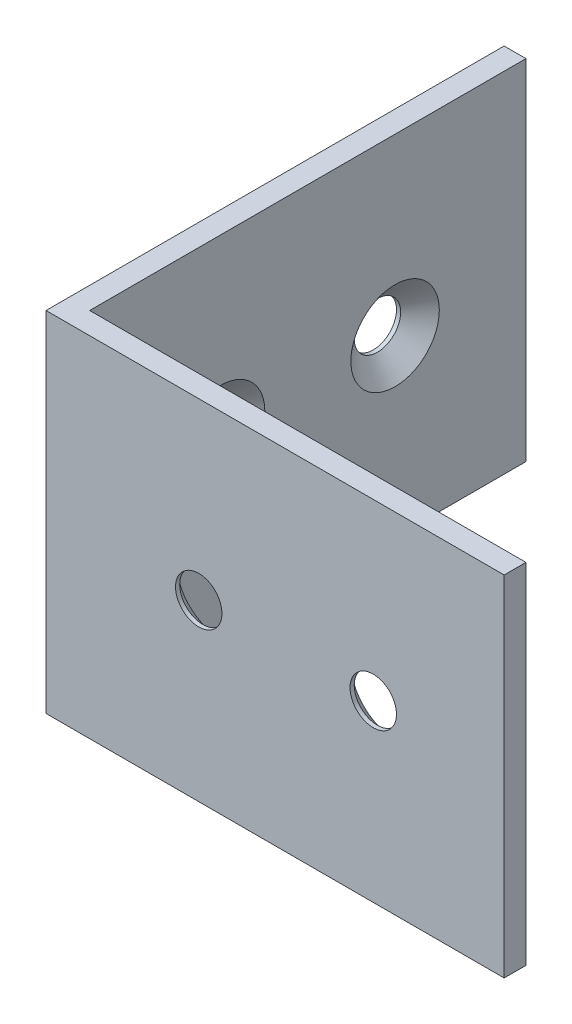
ISO-10303-21;
HEADER;
FILE_DESCRIPTION(('STEP AP214'),'2;1');
FILE_NAME('part.step','',(''),(''),'','','');
FILE_SCHEMA(('AUTOMOTIVE_DESIGN { 1 0 10303 214 1 1 1 1 }'));
ENDSEC;
DATA;
#1=APPLICATION_CONTEXT('core data for automotive mechanical design processes');
#2=APPLICATION_PROTOCOL_DEFINITION('international standard','automotive_design',2000,#1);
#3=PRODUCT_CONTEXT('',#1,'mechanical');
#4=PRODUCT('Part','Part','',(#3));
#5=PRODUCT_RELATED_PRODUCT_CATEGORY('part','',(#4));
#6=PRODUCT_DEFINITION_FORMATION('','',#4);
#7=PRODUCT_DEFINITION_CONTEXT('part definition',#1,'design');
#8=PRODUCT_DEFINITION('design','',#6,#7);
#9=PRODUCT_DEFINITION_SHAPE('','',#8);
#10=(LENGTH_UNIT() NAMED_UNIT(*) SI_UNIT(.MILLI.,.METRE.));
#11=(NAMED_UNIT(*) PLANE_ANGLE_UNIT() SI_UNIT($,.RADIAN.));
#12=(NAMED_UNIT(*) SI_UNIT($,.STERADIAN.) SOLID_ANGLE_UNIT());
#13=UNCERTAINTY_MEASURE_WITH_UNIT(LENGTH_MEASURE(1.E-05),#10,'distance_accuracy_value','');
#14=(GEOMETRIC_REPRESENTATION_CONTEXT(3) GLOBAL_UNCERTAINTY_ASSIGNED_CONTEXT((#13)) GLOBAL_UNIT_ASSIGNED_CONTEXT((#10,
#11,#12)) REPRESENTATION_CONTEXT('',''));
#15=CARTESIAN_POINT('',(0.,0.,0.));
#16=DIRECTION('',(0.,0.,1.));
#17=DIRECTION('',(1.,0.,0.));
#18=AXIS2_PLACEMENT_3D('',#15,#16,#17);
#19=CARTESIAN_POINT('',(66.675,50.8,3.175));
#20=DIRECTION('',(0.,0.,-1.));
#21=DIRECTION('',(-1.,0.,0.));
#22=AXIS2_PLACEMENT_3D('',#19,#20,#21);
#23=PLANE('',#22);
#24=CARTESIAN_POINT('',(47.625,25.4,3.17500000000001));
#25=DIRECTION('',(0.,0.,-1.));
#26=DIRECTION('',(-1.,0.,0.));
#27=AXIS2_PLACEMENT_3D('',#24,#25,#26);
#28=CIRCLE('',#27,3.3782);
#29=CARTESIAN_POINT('',(44.2468,25.4,3.17500000000001));
#30=VERTEX_POINT('',#29);
#31=EDGE_CURVE('E178',#30,#30,#28,.T.);
#32=ORIENTED_EDGE('',*,*,#31,.T.);
#33=EDGE_LOOP('',(#32));
#34=FACE_BOUND('',#33,.T.);
#35=CARTESIAN_POINT('',(22.225,25.4,3.17500000000001));
#36=DIRECTION('',(0.,0.,-1.));
#37=DIRECTION('',(-1.,0.,0.));
#38=AXIS2_PLACEMENT_3D('',#35,#36,#37);
#39=CIRCLE('',#38,3.3782);
#40=CARTESIAN_POINT('',(18.8468,25.4,3.17500000000001));
#41=VERTEX_POINT('',#40);
#42=EDGE_CURVE('E169',#41,#41,#39,.T.);
#43=ORIENTED_EDGE('',*,*,#42,.T.);
#44=EDGE_LOOP('',(#43));
#45=FACE_BOUND('',#44,.T.);
#46=DIRECTION('',(1.,0.,0.));
#47=VECTOR('',#46,1.);
#48=CARTESIAN_POINT('',(66.675,0.,3.175));
#49=LINE('',#48,#47);
#50=CARTESIAN_POINT('',(0.,0.,3.17500000000001));
#51=VERTEX_POINT('',#50);
#52=CARTESIAN_POINT('',(66.675,0.,3.175));
#53=VERTEX_POINT('',#52);
#54=EDGE_CURVE('E127',#51,#53,#49,.T.);
#55=ORIENTED_EDGE('',*,*,#54,.T.);
#56=DIRECTION('',(0.,-1.,0.));
#57=VECTOR('',#56,1.);
#58=CARTESIAN_POINT('',(66.675,50.8,3.175));
#59=LINE('',#58,#57);
#60=CARTESIAN_POINT('',(66.675,50.8,3.175));
#61=VERTEX_POINT('',#60);
#62=EDGE_CURVE('E47',#61,#53,#59,.T.);
#63=ORIENTED_EDGE('',*,*,#62,.F.);
#64=DIRECTION('',(1.,0.,0.));
#65=VECTOR('',#64,1.);
#66=CARTESIAN_POINT('',(66.675,50.8,3.175));
#67=LINE('',#66,#65);
#68=CARTESIAN_POINT('',(0.,50.8,3.17500000000001));
#69=VERTEX_POINT('',#68);
#70=EDGE_CURVE('E93',#69,#61,#67,.T.);
#71=ORIENTED_EDGE('',*,*,#70,.F.);
#72=DIRECTION('',(0.,-1.,0.));
#73=VECTOR('',#72,1.);
#74=CARTESIAN_POINT('',(0.,50.8,3.17500000000001));
#75=LINE('',#74,#73);
#76=EDGE_CURVE('E11',#69,#51,#75,.T.);
#77=ORIENTED_EDGE('',*,*,#76,.T.);
#78=EDGE_LOOP('',(#55,#63,#71,#77));
#79=FACE_BOUND('',#78,.T.);
#80=ADVANCED_FACE('F39',(#34,#45,#79),#23,.F.);
#81=CARTESIAN_POINT('',(66.675,50.8,0.));
#82=DIRECTION('',(-1.,0.,0.));
#83=DIRECTION('',(0.,0.,1.));
#84=AXIS2_PLACEMENT_3D('',#81,#82,#83);
#85=PLANE('',#84);
#86=DIRECTION('',(0.,0.,-1.));
#87=VECTOR('',#86,1.);
#88=CARTESIAN_POINT('',(66.675,0.,0.));
#89=LINE('',#88,#87);
#90=CARTESIAN_POINT('',(66.675,0.,0.));
#91=VERTEX_POINT('',#90);
#92=EDGE_CURVE('E129',#53,#91,#89,.T.);
#93=ORIENTED_EDGE('',*,*,#92,.T.);
#94=DIRECTION('',(0.,-1.,0.));
#95=VECTOR('',#94,1.);
#96=CARTESIAN_POINT('',(66.675,50.8,0.));
#97=LINE('',#96,#95);
#98=CARTESIAN_POINT('',(66.675,50.8,0.));
#99=VERTEX_POINT('',#98);
#100=EDGE_CURVE('E116',#99,#91,#97,.T.);
#101=ORIENTED_EDGE('',*,*,#100,.F.);
#102=DIRECTION('',(0.,0.,-1.));
#103=VECTOR('',#102,1.);
#104=CARTESIAN_POINT('',(66.675,50.8,0.));
#105=LINE('',#104,#103);
#106=EDGE_CURVE('E107',#61,#99,#105,.T.);
#107=ORIENTED_EDGE('',*,*,#106,.F.);
#108=ORIENTED_EDGE('',*,*,#62,.T.);
#109=EDGE_LOOP('',(#93,#101,#107,#108));
#110=FACE_BOUND('',#109,.T.);
#111=ADVANCED_FACE('F142',(#110),#85,.F.);
#112=CARTESIAN_POINT('',(3.175,50.8,0.));
#113=DIRECTION('',(0.,0.,1.));
#114=DIRECTION('',(1.,0.,0.));
#115=AXIS2_PLACEMENT_3D('',#112,#113,#114);
#116=PLANE('',#115);
#117=CARTESIAN_POINT('',(47.625,25.4,0.));
#118=DIRECTION('',(0.,0.,-1.));
#119=DIRECTION('',(-1.,0.,0.));
#120=AXIS2_PLACEMENT_3D('',#117,#118,#119);
#121=CIRCLE('',#120,6.4389);
#122=CARTESIAN_POINT('',(41.1861,25.4,0.));
#123=VERTEX_POINT('',#122);
#124=EDGE_CURVE('E184',#123,#123,#121,.T.);
#125=ORIENTED_EDGE('',*,*,#124,.F.);
#126=EDGE_LOOP('',(#125));
#127=FACE_BOUND('',#126,.T.);
#128=CARTESIAN_POINT('',(22.225,25.4,0.));
#129=DIRECTION('',(0.,0.,-1.));
#130=DIRECTION('',(-1.,0.,0.));
#131=AXIS2_PLACEMENT_3D('',#128,#129,#130);
#132=CIRCLE('',#131,6.4389);
#133=CARTESIAN_POINT('',(15.7861,25.4,0.));
#134=VERTEX_POINT('',#133);
#135=EDGE_CURVE('E175',#134,#134,#132,.T.);
#136=ORIENTED_EDGE('',*,*,#135,.F.);
#137=EDGE_LOOP('',(#136));
#138=FACE_BOUND('',#137,.T.);
#139=DIRECTION('',(-1.,0.,0.));
#140=VECTOR('',#139,1.);
#141=CARTESIAN_POINT('',(3.175,0.,0.));
#142=LINE('',#141,#140);
#143=CARTESIAN_POINT('',(3.175,0.,0.));
#144=VERTEX_POINT('',#143);
#145=EDGE_CURVE('E115',#91,#144,#142,.T.);
#146=ORIENTED_EDGE('',*,*,#145,.T.);
#147=DIRECTION('',(0.,-1.,0.));
#148=VECTOR('',#147,1.);
#149=CARTESIAN_POINT('',(3.175,50.8,0.));
#150=LINE('',#149,#148);
#151=CARTESIAN_POINT('',(3.175,50.8,0.));
#152=VERTEX_POINT('',#151);
#153=EDGE_CURVE('E112',#152,#144,#150,.T.);
#154=ORIENTED_EDGE('',*,*,#153,.F.);
#155=DIRECTION('',(-1.,0.,0.));
#156=VECTOR('',#155,1.);
#157=CARTESIAN_POINT('',(3.175,50.8,0.));
#158=LINE('',#157,#156);
#159=EDGE_CURVE('E101',#99,#152,#158,.T.);
#160=ORIENTED_EDGE('',*,*,#159,.F.);
#161=ORIENTED_EDGE('',*,*,#100,.T.);
#162=EDGE_LOOP('',(#146,#154,#160,#161));
#163=FACE_BOUND('',#162,.T.);
#164=ADVANCED_FACE('F113',(#127,#138,#163),#116,.F.);
#165=CARTESIAN_POINT('',(3.17499999999999,50.8,-63.5));
#166=DIRECTION('',(-1.,0.,0.));
#167=DIRECTION('',(0.,0.,1.));
#168=AXIS2_PLACEMENT_3D('',#165,#166,#167);
#169=PLANE('',#168);
#170=CARTESIAN_POINT('',(3.175,25.4,-19.05));
#171=DIRECTION('',(1.,0.,0.));
#172=DIRECTION('',(0.,0.,-1.));
#173=AXIS2_PLACEMENT_3D('',#170,#171,#172);
#174=CIRCLE('',#173,6.4389);
#175=CARTESIAN_POINT('',(3.175,25.4,-25.4889));
#176=VERTEX_POINT('',#175);
#177=EDGE_CURVE('E166',#176,#176,#174,.T.);
#178=ORIENTED_EDGE('',*,*,#177,.F.);
#179=EDGE_LOOP('',(#178));
#180=FACE_BOUND('',#179,.T.);
#181=CARTESIAN_POINT('',(3.17499999999999,25.4,-44.45));
#182=DIRECTION('',(1.,0.,0.));
#183=DIRECTION('',(0.,0.,-1.));
#184=AXIS2_PLACEMENT_3D('',#181,#182,#183);
#185=CIRCLE('',#184,6.4389);
#186=CARTESIAN_POINT('',(3.17499999999999,25.4,-50.8889));
#187=VERTEX_POINT('',#186);
#188=EDGE_CURVE('E157',#187,#187,#185,.T.);
#189=ORIENTED_EDGE('',*,*,#188,.F.);
#190=EDGE_LOOP('',(#189));
#191=FACE_BOUND('',#190,.T.);
#192=DIRECTION('',(0.,0.,-1.));
#193=VECTOR('',#192,1.);
#194=CARTESIAN_POINT('',(3.17499999999999,0.,-63.5));
#195=LINE('',#194,#193);
#196=CARTESIAN_POINT('',(3.17499999999999,0.,-63.5));
#197=VERTEX_POINT('',#196);
#198=EDGE_CURVE('E79',#144,#197,#195,.T.);
#199=ORIENTED_EDGE('',*,*,#198,.T.);
#200=DIRECTION('',(0.,-1.,0.));
#201=VECTOR('',#200,1.);
#202=CARTESIAN_POINT('',(3.17499999999999,50.8,-63.5));
#203=LINE('',#202,#201);
#204=CARTESIAN_POINT('',(3.17499999999999,50.8,-63.5));
#205=VERTEX_POINT('',#204);
#206=EDGE_CURVE('E117',#205,#197,#203,.T.);
#207=ORIENTED_EDGE('',*,*,#206,.F.);
#208=DIRECTION('',(0.,0.,-1.));
#209=VECTOR('',#208,1.);
#210=CARTESIAN_POINT('',(3.17499999999999,50.8,-63.5));
#211=LINE('',#210,#209);
#212=EDGE_CURVE('E105',#152,#205,#211,.T.);
#213=ORIENTED_EDGE('',*,*,#212,.F.);
#214=ORIENTED_EDGE('',*,*,#153,.T.);
#215=EDGE_LOOP('',(#199,#207,#213,#214));
#216=FACE_BOUND('',#215,.T.);
#217=ADVANCED_FACE('F119',(#180,#191,#216),#169,.F.);
#218=CARTESIAN_POINT('',(0.,50.8,-63.5));
#219=DIRECTION('',(0.,0.,1.));
#220=DIRECTION('',(1.,0.,0.));
#221=AXIS2_PLACEMENT_3D('',#218,#219,#220);
#222=PLANE('',#221);
#223=DIRECTION('',(-1.,0.,0.));
#224=VECTOR('',#223,1.);
#225=CARTESIAN_POINT('',(0.,0.,-63.5));
#226=LINE('',#225,#224);
#227=CARTESIAN_POINT('',(0.,0.,-63.5));
#228=VERTEX_POINT('',#227);
#229=EDGE_CURVE('E86',#197,#228,#226,.T.);
#230=ORIENTED_EDGE('',*,*,#229,.T.);
#231=DIRECTION('',(0.,-1.,0.));
#232=VECTOR('',#231,1.);
#233=CARTESIAN_POINT('',(0.,50.8,-63.5));
#234=LINE('',#233,#232);
#235=CARTESIAN_POINT('',(0.,50.8,-63.5));
#236=VERTEX_POINT('',#235);
#237=EDGE_CURVE('E123',#236,#228,#234,.T.);
#238=ORIENTED_EDGE('',*,*,#237,.F.);
#239=DIRECTION('',(-1.,0.,0.));
#240=VECTOR('',#239,1.);
#241=CARTESIAN_POINT('',(0.,50.8,-63.5));
#242=LINE('',#241,#240);
#243=EDGE_CURVE('E121',#205,#236,#242,.T.);
#244=ORIENTED_EDGE('',*,*,#243,.F.);
#245=ORIENTED_EDGE('',*,*,#206,.T.);
#246=EDGE_LOOP('',(#230,#238,#244,#245));
#247=FACE_BOUND('',#246,.T.);
#248=ADVANCED_FACE('F148',(#247),#222,.F.);
#249=CARTESIAN_POINT('',(0.,50.8,0.));
#250=DIRECTION('',(1.,0.,0.));
#251=DIRECTION('',(0.,0.,-1.));
#252=AXIS2_PLACEMENT_3D('',#249,#250,#251);
#253=PLANE('',#252);
#254=CARTESIAN_POINT('',(0.,25.4,-19.05));
#255=DIRECTION('',(1.,0.,0.));
#256=DIRECTION('',(0.,0.,-1.));
#257=AXIS2_PLACEMENT_3D('',#254,#255,#256);
#258=CIRCLE('',#257,3.3782);
#259=CARTESIAN_POINT('',(0.,25.4,-22.4282));
#260=VERTEX_POINT('',#259);
#261=EDGE_CURVE('E160',#260,#260,#258,.T.);
#262=ORIENTED_EDGE('',*,*,#261,.T.);
#263=EDGE_LOOP('',(#262));
#264=FACE_BOUND('',#263,.T.);
#265=CARTESIAN_POINT('',(0.,25.4,-44.45));
#266=DIRECTION('',(1.,0.,0.));
#267=DIRECTION('',(0.,0.,-1.));
#268=AXIS2_PLACEMENT_3D('',#265,#266,#267);
#269=CIRCLE('',#268,3.3782);
#270=CARTESIAN_POINT('',(0.,25.4,-47.8282));
#271=VERTEX_POINT('',#270);
#272=EDGE_CURVE('E130',#271,#271,#269,.T.);
#273=ORIENTED_EDGE('',*,*,#272,.T.);
#274=EDGE_LOOP('',(#273));
#275=FACE_BOUND('',#274,.T.);
#276=DIRECTION('',(0.,0.,1.));
#277=VECTOR('',#276,1.);
#278=CARTESIAN_POINT('',(0.,0.,0.));
#279=LINE('',#278,#277);
#280=EDGE_CURVE('E135',#228,#51,#279,.T.);
#281=ORIENTED_EDGE('',*,*,#280,.T.);
#282=ORIENTED_EDGE('',*,*,#76,.F.);
#283=DIRECTION('',(0.,0.,1.));
#284=VECTOR('',#283,1.);
#285=CARTESIAN_POINT('',(0.,50.8,3.17500000000001));
#286=LINE('',#285,#284);
#287=EDGE_CURVE('E55',#236,#69,#286,.T.);
#288=ORIENTED_EDGE('',*,*,#287,.F.);
#289=ORIENTED_EDGE('',*,*,#237,.T.);
#290=EDGE_LOOP('',(#281,#282,#288,#289));
#291=FACE_BOUND('',#290,.T.);
#292=ADVANCED_FACE('F147',(#264,#275,#291),#253,.F.);
#293=CARTESIAN_POINT('',(0.,50.8,0.));
#294=DIRECTION('',(0.,-1.,0.));
#295=DIRECTION('',(0.,0.,-1.));
#296=AXIS2_PLACEMENT_3D('',#293,#294,#295);
#297=PLANE('',#296);
#298=ORIENTED_EDGE('',*,*,#287,.T.);
#299=ORIENTED_EDGE('',*,*,#70,.T.);
#300=ORIENTED_EDGE('',*,*,#106,.T.);
#301=ORIENTED_EDGE('',*,*,#159,.T.);
#302=ORIENTED_EDGE('',*,*,#212,.T.);
#303=ORIENTED_EDGE('',*,*,#243,.T.);
#304=EDGE_LOOP('',(#298,#299,#300,#301,#302,#303));
#305=FACE_BOUND('',#304,.T.);
#306=ADVANCED_FACE('F103',(#305),#297,.F.);
#307=CARTESIAN_POINT('',(0.,0.,0.));
#308=DIRECTION('',(0.,-1.,0.));
#309=DIRECTION('',(0.,0.,-1.));
#310=AXIS2_PLACEMENT_3D('',#307,#308,#309);
#311=PLANE('',#310);
#312=ORIENTED_EDGE('',*,*,#54,.F.);
#313=ORIENTED_EDGE('',*,*,#280,.F.);
#314=ORIENTED_EDGE('',*,*,#229,.F.);
#315=ORIENTED_EDGE('',*,*,#198,.F.);
#316=ORIENTED_EDGE('',*,*,#145,.F.);
#317=ORIENTED_EDGE('',*,*,#92,.F.);
#318=EDGE_LOOP('',(#312,#313,#314,#315,#316,#317));
#319=FACE_BOUND('',#318,.T.);
#320=ADVANCED_FACE('F145',(#319),#311,.T.);
#321=CARTESIAN_POINT('',(3.17499999999999,25.4,-44.45));
#322=DIRECTION('',(1.,0.,0.));
#323=DIRECTION('',(0.,0.,-1.));
#324=AXIS2_PLACEMENT_3D('',#321,#322,#323);
#325=CYLINDRICAL_SURFACE('',#324,3.3782);
#326=ORIENTED_EDGE('',*,*,#272,.F.);
#327=EDGE_LOOP('',(#326));
#328=FACE_BOUND('',#327,.T.);
#329=CARTESIAN_POINT('',(0.606767758855687,25.4,-44.45));
#330=DIRECTION('',(1.,0.,0.));
#331=DIRECTION('',(0.,0.,-1.));
#332=AXIS2_PLACEMENT_3D('',#329,#330,#331);
#333=CIRCLE('',#332,3.3782);
#334=CARTESIAN_POINT('',(0.606767758855686,25.4,-47.8282));
#335=VERTEX_POINT('',#334);
#336=EDGE_CURVE('E154',#335,#335,#333,.T.);
#337=ORIENTED_EDGE('',*,*,#336,.T.);
#338=EDGE_LOOP('',(#337));
#339=FACE_BOUND('',#338,.T.);
#340=ADVANCED_FACE('F272',(#328,#339),#325,.F.);
#341=CARTESIAN_POINT('',(3.17499999999999,25.4,-44.45));
#342=DIRECTION('',(1.,0.,0.));
#343=DIRECTION('',(0.,0.,-1.));
#344=AXIS2_PLACEMENT_3D('',#341,#342,#343);
#345=CONICAL_SURFACE('',#344,6.4389,0.872664625997164);
#346=ORIENTED_EDGE('',*,*,#336,.F.);
#347=EDGE_LOOP('',(#346));
#348=FACE_BOUND('',#347,.T.);
#349=ORIENTED_EDGE('',*,*,#188,.T.);
#350=EDGE_LOOP('',(#349));
#351=FACE_BOUND('',#350,.T.);
#352=ADVANCED_FACE('F262',(#348,#351),#345,.F.);
#353=CARTESIAN_POINT('',(3.175,25.4,-19.05));
#354=DIRECTION('',(1.,0.,0.));
#355=DIRECTION('',(0.,0.,-1.));
#356=AXIS2_PLACEMENT_3D('',#353,#354,#355);
#357=CYLINDRICAL_SURFACE('',#356,3.3782);
#358=ORIENTED_EDGE('',*,*,#261,.F.);
#359=EDGE_LOOP('',(#358));
#360=FACE_BOUND('',#359,.T.);
#361=CARTESIAN_POINT('',(0.606767758855694,25.4,-19.05));
#362=DIRECTION('',(1.,0.,0.));
#363=DIRECTION('',(0.,0.,-1.));
#364=AXIS2_PLACEMENT_3D('',#361,#362,#363);
#365=CIRCLE('',#364,3.3782);
#366=CARTESIAN_POINT('',(0.606767758855693,25.4,-22.4282));
#367=VERTEX_POINT('',#366);
#368=EDGE_CURVE('E163',#367,#367,#365,.T.);
#369=ORIENTED_EDGE('',*,*,#368,.T.);
#370=EDGE_LOOP('',(#369));
#371=FACE_BOUND('',#370,.T.);
#372=ADVANCED_FACE('F252',(#360,#371),#357,.F.);
#373=CARTESIAN_POINT('',(3.175,25.4,-19.05));
#374=DIRECTION('',(1.,0.,0.));
#375=DIRECTION('',(0.,0.,-1.));
#376=AXIS2_PLACEMENT_3D('',#373,#374,#375);
#377=CONICAL_SURFACE('',#376,6.4389,0.872664625997164);
#378=ORIENTED_EDGE('',*,*,#368,.F.);
#379=EDGE_LOOP('',(#378));
#380=FACE_BOUND('',#379,.T.);
#381=ORIENTED_EDGE('',*,*,#177,.T.);
#382=EDGE_LOOP('',(#381));
#383=FACE_BOUND('',#382,.T.);
#384=ADVANCED_FACE('F207',(#380,#383),#377,.F.);
#385=CARTESIAN_POINT('',(22.225,25.4,0.));
#386=DIRECTION('',(0.,0.,-1.));
#387=DIRECTION('',(-1.,0.,0.));
#388=AXIS2_PLACEMENT_3D('',#385,#386,#387);
#389=CYLINDRICAL_SURFACE('',#388,3.37819999999999);
#390=ORIENTED_EDGE('',*,*,#42,.F.);
#391=EDGE_LOOP('',(#390));
#392=FACE_BOUND('',#391,.T.);
#393=CARTESIAN_POINT('',(22.225,25.4,2.56823224114432));
#394=DIRECTION('',(0.,0.,-1.));
#395=DIRECTION('',(-1.,0.,0.));
#396=AXIS2_PLACEMENT_3D('',#393,#394,#395);
#397=CIRCLE('',#396,3.37819999999999);
#398=CARTESIAN_POINT('',(18.8468,25.4,2.56823224114432));
#399=VERTEX_POINT('',#398);
#400=EDGE_CURVE('E172',#399,#399,#397,.T.);
#401=ORIENTED_EDGE('',*,*,#400,.T.);
#402=EDGE_LOOP('',(#401));
#403=FACE_BOUND('',#402,.T.);
#404=ADVANCED_FACE('F198',(#392,#403),#389,.F.);
#405=CARTESIAN_POINT('',(22.225,25.4,0.));
#406=DIRECTION('',(0.,0.,-1.));
#407=DIRECTION('',(-1.,0.,0.));
#408=AXIS2_PLACEMENT_3D('',#405,#406,#407);
#409=CONICAL_SURFACE('',#408,6.4389,0.872664625997164);
#410=ORIENTED_EDGE('',*,*,#400,.F.);
#411=EDGE_LOOP('',(#410));
#412=FACE_BOUND('',#411,.T.);
#413=ORIENTED_EDGE('',*,*,#135,.T.);
#414=EDGE_LOOP('',(#413));
#415=FACE_BOUND('',#414,.T.);
#416=ADVANCED_FACE('F195',(#412,#415),#409,.F.);
#417=CARTESIAN_POINT('',(47.625,25.4,0.));
#418=DIRECTION('',(0.,0.,-1.));
#419=DIRECTION('',(-1.,0.,0.));
#420=AXIS2_PLACEMENT_3D('',#417,#418,#419);
#421=CYLINDRICAL_SURFACE('',#420,3.37819999999999);
#422=ORIENTED_EDGE('',*,*,#31,.F.);
#423=EDGE_LOOP('',(#422));
#424=FACE_BOUND('',#423,.T.);
#425=CARTESIAN_POINT('',(47.625,25.4,2.56823224114432));
#426=DIRECTION('',(0.,0.,-1.));
#427=DIRECTION('',(-1.,0.,0.));
#428=AXIS2_PLACEMENT_3D('',#425,#426,#427);
#429=CIRCLE('',#428,3.37819999999998);
#430=CARTESIAN_POINT('',(44.2468,25.4,2.56823224114432));
#431=VERTEX_POINT('',#430);
#432=EDGE_CURVE('E181',#431,#431,#429,.T.);
#433=ORIENTED_EDGE('',*,*,#432,.T.);
#434=EDGE_LOOP('',(#433));
#435=FACE_BOUND('',#434,.T.);
#436=ADVANCED_FACE('F197',(#424,#435),#421,.F.);
#437=CARTESIAN_POINT('',(47.625,25.4,0.));
#438=DIRECTION('',(0.,0.,-1.));
#439=DIRECTION('',(-1.,0.,0.));
#440=AXIS2_PLACEMENT_3D('',#437,#438,#439);
#441=CONICAL_SURFACE('',#440,6.4389,0.872664625997164);
#442=ORIENTED_EDGE('',*,*,#432,.F.);
#443=EDGE_LOOP('',(#442));
#444=FACE_BOUND('',#443,.T.);
#445=ORIENTED_EDGE('',*,*,#124,.T.);
#446=EDGE_LOOP('',(#445));
#447=FACE_BOUND('',#446,.T.);
#448=ADVANCED_FACE('F188',(#444,#447),#441,.F.);
#449=CLOSED_SHELL('',(#80,#111,#164,#217,#248,#292,#306,#320,#340,#352,#372,#384,#404,#416,#436,#448));
#450=MANIFOLD_SOLID_BREP('B2',#449);
#451=ADVANCED_BREP_SHAPE_REPRESENTATION('',(#18,#450),#14);
#452=SHAPE_DEFINITION_REPRESENTATION(#9,#451);
ENDSEC;
END-ISO-10303-21;
